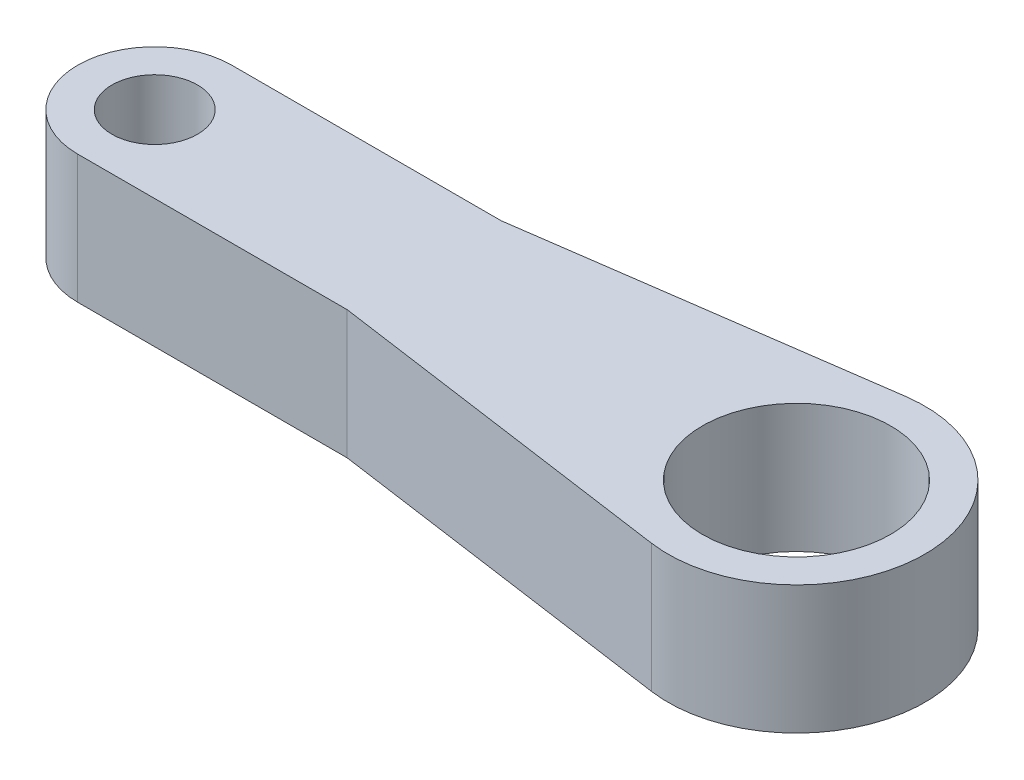
ISO-10303-21;
HEADER;
FILE_DESCRIPTION(('STEP AP214'),'2;1');
FILE_NAME('part.step','',(''),(''),'','','');
FILE_SCHEMA(('AUTOMOTIVE_DESIGN { 1 0 10303 214 1 1 1 1 }'));
ENDSEC;
DATA;
#1=APPLICATION_CONTEXT('core data for automotive mechanical design processes');
#2=APPLICATION_PROTOCOL_DEFINITION('international standard','automotive_design',2000,#1);
#3=PRODUCT_CONTEXT('',#1,'mechanical');
#4=PRODUCT('Part','Part','',(#3));
#5=PRODUCT_RELATED_PRODUCT_CATEGORY('part','',(#4));
#6=PRODUCT_DEFINITION_FORMATION('','',#4);
#7=PRODUCT_DEFINITION_CONTEXT('part definition',#1,'design');
#8=PRODUCT_DEFINITION('design','',#6,#7);
#9=PRODUCT_DEFINITION_SHAPE('','',#8);
#10=(LENGTH_UNIT() NAMED_UNIT(*) SI_UNIT(.MILLI.,.METRE.));
#11=(NAMED_UNIT(*) PLANE_ANGLE_UNIT() SI_UNIT($,.RADIAN.));
#12=(NAMED_UNIT(*) SI_UNIT($,.STERADIAN.) SOLID_ANGLE_UNIT());
#13=UNCERTAINTY_MEASURE_WITH_UNIT(LENGTH_MEASURE(1.E-05),#10,'distance_accuracy_value','');
#14=(GEOMETRIC_REPRESENTATION_CONTEXT(3) GLOBAL_UNCERTAINTY_ASSIGNED_CONTEXT((#13)) GLOBAL_UNIT_ASSIGNED_CONTEXT((#10,
#11,#12)) REPRESENTATION_CONTEXT('',''));
#15=CARTESIAN_POINT('',(0.,0.,0.));
#16=DIRECTION('',(0.,0.,1.));
#17=DIRECTION('',(1.,0.,0.));
#18=AXIS2_PLACEMENT_3D('',#15,#16,#17);
#19=CARTESIAN_POINT('',(0.,15.,0.));
#20=DIRECTION('',(0.,-1.,0.));
#21=DIRECTION('',(0.,0.,-1.));
#22=AXIS2_PLACEMENT_3D('',#19,#20,#21);
#23=CYLINDRICAL_SURFACE('',#22,15.);
#24=CARTESIAN_POINT('',(0.,0.,0.));
#25=DIRECTION('',(0.,1.,0.));
#26=DIRECTION('',(0.,0.,1.));
#27=AXIS2_PLACEMENT_3D('',#24,#25,#26);
#28=CIRCLE('',#27,15.);
#29=CARTESIAN_POINT('',(-2.09951564919277,0.,14.8523410289016));
#30=VERTEX_POINT('',#29);
#31=CARTESIAN_POINT('',(-2.09951564919277,0.,-14.8523410289016));
#32=VERTEX_POINT('',#31);
#33=EDGE_CURVE('E137',#30,#32,#28,.T.);
#34=ORIENTED_EDGE('',*,*,#33,.T.);
#35=DIRECTION('',(0.,-1.,0.));
#36=VECTOR('',#35,1.);
#37=CARTESIAN_POINT('',(-2.09951564919277,15.,-14.8523410289016));
#38=LINE('',#37,#36);
#39=CARTESIAN_POINT('',(-2.09951564919277,15.,-14.8523410289016));
#40=VERTEX_POINT('',#39);
#41=EDGE_CURVE('E11',#40,#32,#38,.T.);
#42=ORIENTED_EDGE('',*,*,#41,.F.);
#43=CARTESIAN_POINT('',(0.,15.,0.));
#44=DIRECTION('',(0.,1.,0.));
#45=DIRECTION('',(0.,0.,1.));
#46=AXIS2_PLACEMENT_3D('',#43,#44,#45);
#47=CIRCLE('',#46,15.);
#48=CARTESIAN_POINT('',(-2.09951564919277,15.,14.8523410289016));
#49=VERTEX_POINT('',#48);
#50=EDGE_CURVE('E92',#49,#40,#47,.T.);
#51=ORIENTED_EDGE('',*,*,#50,.F.);
#52=DIRECTION('',(0.,-1.,0.));
#53=VECTOR('',#52,1.);
#54=CARTESIAN_POINT('',(-2.09951564919277,15.,14.8523410289016));
#55=LINE('',#54,#53);
#56=EDGE_CURVE('E136',#49,#30,#55,.T.);
#57=ORIENTED_EDGE('',*,*,#56,.T.);
#58=EDGE_LOOP('',(#34,#42,#51,#57));
#59=FACE_BOUND('',#58,.T.);
#60=ADVANCED_FACE('F41',(#59),#23,.T.);
#61=CARTESIAN_POINT('',(-2.09951564919277,15.,-14.8523410289016));
#62=DIRECTION('',(-0.139967709946185,0.,-0.990156068593442));
#63=DIRECTION('',(-0.990156068593442,0.,0.139967709946185));
#64=AXIS2_PLACEMENT_3D('',#61,#62,#63);
#65=PLANE('',#64);
#66=DIRECTION('',(0.990156068593442,0.,-0.139967709946185));
#67=VECTOR('',#66,1.);
#68=CARTESIAN_POINT('',(-2.09951564919277,0.,-14.8523410289016));
#69=LINE('',#68,#67);
#70=CARTESIAN_POINT('',(-43.5,0.,-8.99999999999999));
#71=VERTEX_POINT('',#70);
#72=EDGE_CURVE('E141',#71,#32,#69,.T.);
#73=ORIENTED_EDGE('',*,*,#72,.F.);
#74=DIRECTION('',(0.,-1.,0.));
#75=VECTOR('',#74,1.);
#76=CARTESIAN_POINT('',(-43.5,15.,-8.99999999999999));
#77=LINE('',#76,#75);
#78=CARTESIAN_POINT('',(-43.5,15.,-8.99999999999999));
#79=VERTEX_POINT('',#78);
#80=EDGE_CURVE('E50',#79,#71,#77,.T.);
#81=ORIENTED_EDGE('',*,*,#80,.F.);
#82=DIRECTION('',(0.990156068593442,0.,-0.139967709946185));
#83=VECTOR('',#82,1.);
#84=CARTESIAN_POINT('',(-2.09951564919277,15.,-14.8523410289016));
#85=LINE('',#84,#83);
#86=EDGE_CURVE('E291',#79,#40,#85,.T.);
#87=ORIENTED_EDGE('',*,*,#86,.T.);
#88=ORIENTED_EDGE('',*,*,#41,.T.);
#89=EDGE_LOOP('',(#73,#81,#87,#88));
#90=FACE_BOUND('',#89,.T.);
#91=ADVANCED_FACE('F175',(#90),#65,.T.);
#92=CARTESIAN_POINT('',(0.,15.,-8.99999999999999));
#93=DIRECTION('',(0.,0.,-1.));
#94=DIRECTION('',(-1.,0.,0.));
#95=AXIS2_PLACEMENT_3D('',#92,#93,#94);
#96=PLANE('',#95);
#97=DIRECTION('',(1.,0.,0.));
#98=VECTOR('',#97,1.);
#99=CARTESIAN_POINT('',(0.,0.,-8.99999999999999));
#100=LINE('',#99,#98);
#101=CARTESIAN_POINT('',(-75.,0.,-8.99999999999999));
#102=VERTEX_POINT('',#101);
#103=EDGE_CURVE('E145',#102,#71,#100,.T.);
#104=ORIENTED_EDGE('',*,*,#103,.F.);
#105=DIRECTION('',(0.,-1.,0.));
#106=VECTOR('',#105,1.);
#107=CARTESIAN_POINT('',(-75.,15.,-8.99999999999999));
#108=LINE('',#107,#106);
#109=CARTESIAN_POINT('',(-75.,15.,-8.99999999999999));
#110=VERTEX_POINT('',#109);
#111=EDGE_CURVE('E118',#110,#102,#108,.T.);
#112=ORIENTED_EDGE('',*,*,#111,.F.);
#113=DIRECTION('',(1.,0.,0.));
#114=VECTOR('',#113,1.);
#115=CARTESIAN_POINT('',(0.,15.,-8.99999999999999));
#116=LINE('',#115,#114);
#117=EDGE_CURVE('E109',#110,#79,#116,.T.);
#118=ORIENTED_EDGE('',*,*,#117,.T.);
#119=ORIENTED_EDGE('',*,*,#80,.T.);
#120=EDGE_LOOP('',(#104,#112,#118,#119));
#121=FACE_BOUND('',#120,.T.);
#122=ADVANCED_FACE('F172',(#121),#96,.T.);
#123=CARTESIAN_POINT('',(-75.,15.,0.));
#124=DIRECTION('',(0.,-1.,0.));
#125=DIRECTION('',(0.,0.,-1.));
#126=AXIS2_PLACEMENT_3D('',#123,#124,#125);
#127=CYLINDRICAL_SURFACE('',#126,9.);
#128=CARTESIAN_POINT('',(-75.,0.,0.));
#129=DIRECTION('',(0.,1.,0.));
#130=DIRECTION('',(0.,0.,1.));
#131=AXIS2_PLACEMENT_3D('',#128,#129,#130);
#132=CIRCLE('',#131,9.);
#133=CARTESIAN_POINT('',(-75.,0.,9.));
#134=VERTEX_POINT('',#133);
#135=EDGE_CURVE('E116',#102,#134,#132,.T.);
#136=ORIENTED_EDGE('',*,*,#135,.T.);
#137=DIRECTION('',(0.,-1.,0.));
#138=VECTOR('',#137,1.);
#139=CARTESIAN_POINT('',(-75.,15.,9.));
#140=LINE('',#139,#138);
#141=CARTESIAN_POINT('',(-75.,15.,9.));
#142=VERTEX_POINT('',#141);
#143=EDGE_CURVE('E113',#142,#134,#140,.T.);
#144=ORIENTED_EDGE('',*,*,#143,.F.);
#145=CARTESIAN_POINT('',(-75.,15.,0.));
#146=DIRECTION('',(0.,1.,0.));
#147=DIRECTION('',(0.,0.,1.));
#148=AXIS2_PLACEMENT_3D('',#145,#146,#147);
#149=CIRCLE('',#148,9.);
#150=EDGE_CURVE('E102',#110,#142,#149,.T.);
#151=ORIENTED_EDGE('',*,*,#150,.F.);
#152=ORIENTED_EDGE('',*,*,#111,.T.);
#153=EDGE_LOOP('',(#136,#144,#151,#152));
#154=FACE_BOUND('',#153,.T.);
#155=ADVANCED_FACE('F114',(#154),#127,.T.);
#156=CARTESIAN_POINT('',(0.,15.,9.));
#157=DIRECTION('',(0.,0.,-1.));
#158=DIRECTION('',(-1.,0.,0.));
#159=AXIS2_PLACEMENT_3D('',#156,#157,#158);
#160=PLANE('',#159);
#161=DIRECTION('',(1.,0.,0.));
#162=VECTOR('',#161,1.);
#163=CARTESIAN_POINT('',(0.,0.,9.));
#164=LINE('',#163,#162);
#165=CARTESIAN_POINT('',(-43.5,0.,9.));
#166=VERTEX_POINT('',#165);
#167=EDGE_CURVE('E80',#134,#166,#164,.T.);
#168=ORIENTED_EDGE('',*,*,#167,.T.);
#169=DIRECTION('',(0.,-1.,0.));
#170=VECTOR('',#169,1.);
#171=CARTESIAN_POINT('',(-43.5,15.,9.));
#172=LINE('',#171,#170);
#173=CARTESIAN_POINT('',(-43.5,15.,9.));
#174=VERTEX_POINT('',#173);
#175=EDGE_CURVE('E119',#174,#166,#172,.T.);
#176=ORIENTED_EDGE('',*,*,#175,.F.);
#177=DIRECTION('',(1.,0.,0.));
#178=VECTOR('',#177,1.);
#179=CARTESIAN_POINT('',(0.,15.,9.));
#180=LINE('',#179,#178);
#181=EDGE_CURVE('E107',#142,#174,#180,.T.);
#182=ORIENTED_EDGE('',*,*,#181,.F.);
#183=ORIENTED_EDGE('',*,*,#143,.T.);
#184=EDGE_LOOP('',(#168,#176,#182,#183));
#185=FACE_BOUND('',#184,.T.);
#186=ADVANCED_FACE('F121',(#185),#160,.F.);
#187=CARTESIAN_POINT('',(-75.,15.,0.));
#188=DIRECTION('',(0.,-1.,0.));
#189=DIRECTION('',(0.,0.,-1.));
#190=AXIS2_PLACEMENT_3D('',#187,#188,#189);
#191=CYLINDRICAL_SURFACE('',#190,5.);
#192=CARTESIAN_POINT('',(-75.,15.,0.));
#193=DIRECTION('',(0.,1.,0.));
#194=DIRECTION('',(0.,0.,1.));
#195=AXIS2_PLACEMENT_3D('',#192,#193,#194);
#196=CIRCLE('',#195,5.);
#197=CARTESIAN_POINT('',(-75.,15.,5.00000000000001));
#198=VERTEX_POINT('',#197);
#199=EDGE_CURVE('E125',#198,#198,#196,.T.);
#200=ORIENTED_EDGE('',*,*,#199,.T.);
#201=EDGE_LOOP('',(#200));
#202=FACE_BOUND('',#201,.T.);
#203=CARTESIAN_POINT('',(-75.,0.,0.));
#204=DIRECTION('',(0.,1.,0.));
#205=DIRECTION('',(0.,0.,1.));
#206=AXIS2_PLACEMENT_3D('',#203,#204,#205);
#207=CIRCLE('',#206,5.);
#208=CARTESIAN_POINT('',(-75.,0.,5.00000000000001));
#209=VERTEX_POINT('',#208);
#210=EDGE_CURVE('E155',#209,#209,#207,.T.);
#211=ORIENTED_EDGE('',*,*,#210,.F.);
#212=EDGE_LOOP('',(#211));
#213=FACE_BOUND('',#212,.T.);
#214=ADVANCED_FACE('F184',(#202,#213),#191,.F.);
#215=CARTESIAN_POINT('',(-2.09951564919277,15.,14.8523410289016));
#216=DIRECTION('',(0.139967709946185,0.,-0.990156068593442));
#217=DIRECTION('',(-0.990156068593442,0.,-0.139967709946185));
#218=AXIS2_PLACEMENT_3D('',#215,#216,#217);
#219=PLANE('',#218);
#220=DIRECTION('',(0.990156068593442,0.,0.139967709946185));
#221=VECTOR('',#220,1.);
#222=CARTESIAN_POINT('',(-2.09951564919277,0.,14.8523410289016));
#223=LINE('',#222,#221);
#224=EDGE_CURVE('E86',#166,#30,#223,.T.);
#225=ORIENTED_EDGE('',*,*,#224,.T.);
#226=ORIENTED_EDGE('',*,*,#56,.F.);
#227=DIRECTION('',(0.990156068593442,0.,0.139967709946185));
#228=VECTOR('',#227,1.);
#229=CARTESIAN_POINT('',(-2.09951564919277,15.,14.8523410289016));
#230=LINE('',#229,#228);
#231=EDGE_CURVE('E58',#174,#49,#230,.T.);
#232=ORIENTED_EDGE('',*,*,#231,.F.);
#233=ORIENTED_EDGE('',*,*,#175,.T.);
#234=EDGE_LOOP('',(#225,#226,#232,#233));
#235=FACE_BOUND('',#234,.T.);
#236=ADVANCED_FACE('F181',(#235),#219,.F.);
#237=CARTESIAN_POINT('',(0.,15.,0.));
#238=DIRECTION('',(0.,-1.,0.));
#239=DIRECTION('',(0.,0.,-1.));
#240=AXIS2_PLACEMENT_3D('',#237,#238,#239);
#241=CYLINDRICAL_SURFACE('',#240,11.);
#242=CARTESIAN_POINT('',(0.,15.,0.));
#243=DIRECTION('',(0.,1.,0.));
#244=DIRECTION('',(0.,0.,1.));
#245=AXIS2_PLACEMENT_3D('',#242,#243,#244);
#246=CIRCLE('',#245,11.);
#247=CARTESIAN_POINT('',(0.,15.,11.));
#248=VERTEX_POINT('',#247);
#249=EDGE_CURVE('E132',#248,#248,#246,.T.);
#250=ORIENTED_EDGE('',*,*,#249,.T.);
#251=EDGE_LOOP('',(#250));
#252=FACE_BOUND('',#251,.T.);
#253=CARTESIAN_POINT('',(0.,0.,0.));
#254=DIRECTION('',(0.,1.,0.));
#255=DIRECTION('',(0.,0.,1.));
#256=AXIS2_PLACEMENT_3D('',#253,#254,#255);
#257=CIRCLE('',#256,11.);
#258=CARTESIAN_POINT('',(0.,0.,11.));
#259=VERTEX_POINT('',#258);
#260=EDGE_CURVE('E159',#259,#259,#257,.T.);
#261=ORIENTED_EDGE('',*,*,#260,.F.);
#262=EDGE_LOOP('',(#261));
#263=FACE_BOUND('',#262,.T.);
#264=ADVANCED_FACE('F183',(#252,#263),#241,.F.);
#265=CARTESIAN_POINT('',(0.,15.,0.));
#266=DIRECTION('',(0.,1.,0.));
#267=DIRECTION('',(0.,0.,1.));
#268=AXIS2_PLACEMENT_3D('',#265,#266,#267);
#269=PLANE('',#268);
#270=ORIENTED_EDGE('',*,*,#50,.T.);
#271=ORIENTED_EDGE('',*,*,#86,.F.);
#272=ORIENTED_EDGE('',*,*,#117,.F.);
#273=ORIENTED_EDGE('',*,*,#150,.T.);
#274=ORIENTED_EDGE('',*,*,#181,.T.);
#275=ORIENTED_EDGE('',*,*,#231,.T.);
#276=EDGE_LOOP('',(#270,#271,#272,#273,#274,#275));
#277=FACE_BOUND('',#276,.T.);
#278=ORIENTED_EDGE('',*,*,#199,.F.);
#279=EDGE_LOOP('',(#278));
#280=FACE_BOUND('',#279,.T.);
#281=ORIENTED_EDGE('',*,*,#249,.F.);
#282=EDGE_LOOP('',(#281));
#283=FACE_BOUND('',#282,.T.);
#284=ADVANCED_FACE('F104',(#277,#280,#283),#269,.T.);
#285=CARTESIAN_POINT('',(0.,0.,0.));
#286=DIRECTION('',(0.,1.,0.));
#287=DIRECTION('',(0.,0.,1.));
#288=AXIS2_PLACEMENT_3D('',#285,#286,#287);
#289=PLANE('',#288);
#290=ORIENTED_EDGE('',*,*,#33,.F.);
#291=ORIENTED_EDGE('',*,*,#224,.F.);
#292=ORIENTED_EDGE('',*,*,#167,.F.);
#293=ORIENTED_EDGE('',*,*,#135,.F.);
#294=ORIENTED_EDGE('',*,*,#103,.T.);
#295=ORIENTED_EDGE('',*,*,#72,.T.);
#296=EDGE_LOOP('',(#290,#291,#292,#293,#294,#295));
#297=FACE_BOUND('',#296,.T.);
#298=ORIENTED_EDGE('',*,*,#210,.T.);
#299=EDGE_LOOP('',(#298));
#300=FACE_BOUND('',#299,.T.);
#301=ORIENTED_EDGE('',*,*,#260,.T.);
#302=EDGE_LOOP('',(#301));
#303=FACE_BOUND('',#302,.T.);
#304=ADVANCED_FACE('F178',(#297,#300,#303),#289,.F.);
#305=CLOSED_SHELL('',(#60,#91,#122,#155,#186,#214,#236,#264,#284,#304));
#306=MANIFOLD_SOLID_BREP('B2',#305);
#307=ADVANCED_BREP_SHAPE_REPRESENTATION('',(#18,#306),#14);
#308=SHAPE_DEFINITION_REPRESENTATION(#9,#307);
ENDSEC;
END-ISO-10303-21;
